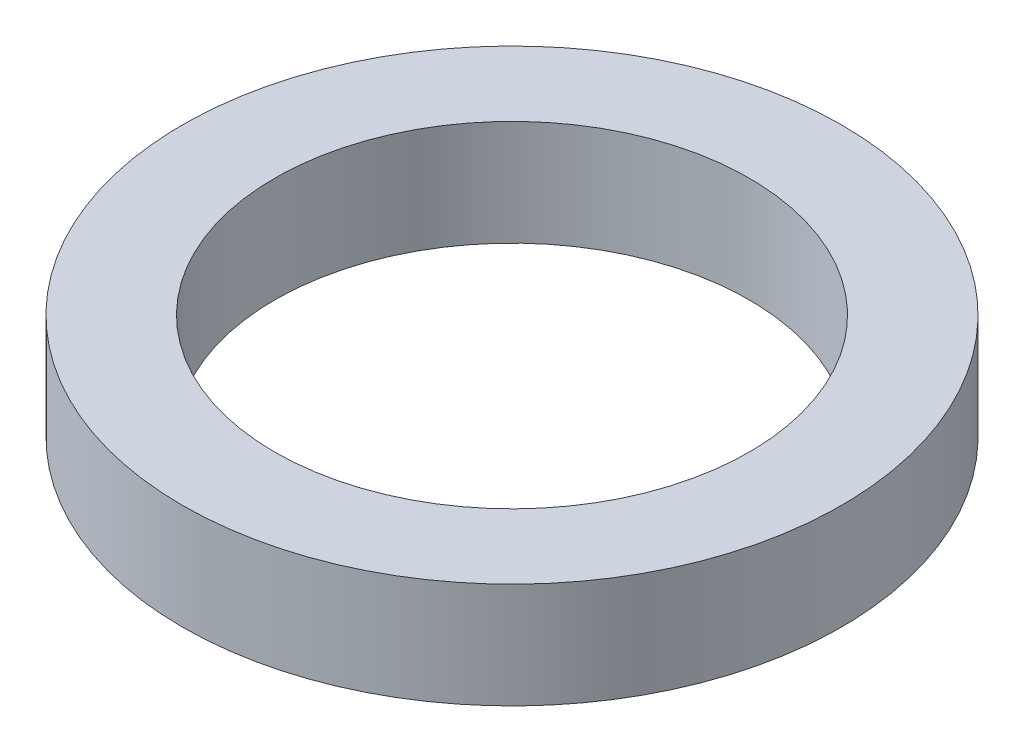
ISO-10303-21;
HEADER;
FILE_DESCRIPTION(('STEP AP214'),'2;1');
FILE_NAME('part.step','',(''),(''),'','','');
FILE_SCHEMA(('AUTOMOTIVE_DESIGN { 1 0 10303 214 1 1 1 1 }'));
ENDSEC;
DATA;
#1=APPLICATION_CONTEXT('core data for automotive mechanical design processes');
#2=APPLICATION_PROTOCOL_DEFINITION('international standard','automotive_design',2000,#1);
#3=PRODUCT_CONTEXT('',#1,'mechanical');
#4=PRODUCT('Part','Part','',(#3));
#5=PRODUCT_RELATED_PRODUCT_CATEGORY('part','',(#4));
#6=PRODUCT_DEFINITION_FORMATION('','',#4);
#7=PRODUCT_DEFINITION_CONTEXT('part definition',#1,'design');
#8=PRODUCT_DEFINITION('design','',#6,#7);
#9=PRODUCT_DEFINITION_SHAPE('','',#8);
#10=(LENGTH_UNIT() NAMED_UNIT(*) SI_UNIT(.MILLI.,.METRE.));
#11=(NAMED_UNIT(*) PLANE_ANGLE_UNIT() SI_UNIT($,.RADIAN.));
#12=(NAMED_UNIT(*) SI_UNIT($,.STERADIAN.) SOLID_ANGLE_UNIT());
#13=UNCERTAINTY_MEASURE_WITH_UNIT(LENGTH_MEASURE(1.E-05),#10,'distance_accuracy_value','');
#14=(GEOMETRIC_REPRESENTATION_CONTEXT(3) GLOBAL_UNCERTAINTY_ASSIGNED_CONTEXT((#13)) GLOBAL_UNIT_ASSIGNED_CONTEXT((#10,
#11,#12)) REPRESENTATION_CONTEXT('',''));
#15=CARTESIAN_POINT('',(0.,0.,0.));
#16=DIRECTION('',(0.,0.,1.));
#17=DIRECTION('',(1.,0.,0.));
#18=AXIS2_PLACEMENT_3D('',#15,#16,#17);
#19=CARTESIAN_POINT('',(0.,20.,0.));
#20=DIRECTION('',(0.,1.,0.));
#21=DIRECTION('',(0.,0.,1.));
#22=AXIS2_PLACEMENT_3D('',#19,#20,#21);
#23=PLANE('',#22);
#24=CARTESIAN_POINT('',(0.,20.,0.));
#25=DIRECTION('',(0.,1.,0.));
#26=DIRECTION('',(0.,0.,1.));
#27=AXIS2_PLACEMENT_3D('',#24,#25,#26);
#28=CIRCLE('',#27,62.5);
#29=CARTESIAN_POINT('',(0.,20.,62.5));
#30=VERTEX_POINT('',#29);
#31=EDGE_CURVE('E10',#30,#30,#28,.T.);
#32=ORIENTED_EDGE('',*,*,#31,.T.);
#33=EDGE_LOOP('',(#32));
#34=FACE_BOUND('',#33,.T.);
#35=CARTESIAN_POINT('',(0.,20.,0.));
#36=DIRECTION('',(0.,1.,0.));
#37=DIRECTION('',(0.,0.,1.));
#38=AXIS2_PLACEMENT_3D('',#35,#36,#37);
#39=CIRCLE('',#38,45.);
#40=CARTESIAN_POINT('',(0.,20.,45.));
#41=VERTEX_POINT('',#40);
#42=EDGE_CURVE('E44',#41,#41,#39,.T.);
#43=ORIENTED_EDGE('',*,*,#42,.F.);
#44=EDGE_LOOP('',(#43));
#45=FACE_BOUND('',#44,.T.);
#46=ADVANCED_FACE('F33',(#34,#45),#23,.T.);
#47=CARTESIAN_POINT('',(0.,0.,0.));
#48=DIRECTION('',(0.,1.,0.));
#49=DIRECTION('',(0.,0.,1.));
#50=AXIS2_PLACEMENT_3D('',#47,#48,#49);
#51=PLANE('',#50);
#52=CARTESIAN_POINT('',(0.,0.,0.));
#53=DIRECTION('',(0.,1.,0.));
#54=DIRECTION('',(0.,0.,1.));
#55=AXIS2_PLACEMENT_3D('',#52,#53,#54);
#56=CIRCLE('',#55,62.5);
#57=CARTESIAN_POINT('',(0.,0.,62.5));
#58=VERTEX_POINT('',#57);
#59=EDGE_CURVE('E37',#58,#58,#56,.T.);
#60=ORIENTED_EDGE('',*,*,#59,.F.);
#61=EDGE_LOOP('',(#60));
#62=FACE_BOUND('',#61,.T.);
#63=CARTESIAN_POINT('',(0.,0.,0.));
#64=DIRECTION('',(0.,1.,0.));
#65=DIRECTION('',(0.,0.,1.));
#66=AXIS2_PLACEMENT_3D('',#63,#64,#65);
#67=CIRCLE('',#66,45.);
#68=CARTESIAN_POINT('',(0.,0.,45.));
#69=VERTEX_POINT('',#68);
#70=EDGE_CURVE('E46',#69,#69,#67,.T.);
#71=ORIENTED_EDGE('',*,*,#70,.T.);
#72=EDGE_LOOP('',(#71));
#73=FACE_BOUND('',#72,.T.);
#74=ADVANCED_FACE('F56',(#62,#73),#51,.F.);
#75=CARTESIAN_POINT('',(0.,20.,0.));
#76=DIRECTION('',(0.,-1.,0.));
#77=DIRECTION('',(0.,0.,-1.));
#78=AXIS2_PLACEMENT_3D('',#75,#76,#77);
#79=CYLINDRICAL_SURFACE('',#78,62.5);
#80=ORIENTED_EDGE('',*,*,#31,.F.);
#81=EDGE_LOOP('',(#80));
#82=FACE_BOUND('',#81,.T.);
#83=ORIENTED_EDGE('',*,*,#59,.T.);
#84=EDGE_LOOP('',(#83));
#85=FACE_BOUND('',#84,.T.);
#86=ADVANCED_FACE('F35',(#82,#85),#79,.T.);
#87=CARTESIAN_POINT('',(0.,20.,0.));
#88=DIRECTION('',(0.,-1.,0.));
#89=DIRECTION('',(0.,0.,-1.));
#90=AXIS2_PLACEMENT_3D('',#87,#88,#89);
#91=CYLINDRICAL_SURFACE('',#90,45.);
#92=ORIENTED_EDGE('',*,*,#42,.T.);
#93=EDGE_LOOP('',(#92));
#94=FACE_BOUND('',#93,.T.);
#95=ORIENTED_EDGE('',*,*,#70,.F.);
#96=EDGE_LOOP('',(#95));
#97=FACE_BOUND('',#96,.T.);
#98=ADVANCED_FACE('F52',(#94,#97),#91,.F.);
#99=CLOSED_SHELL('',(#46,#74,#86,#98));
#100=MANIFOLD_SOLID_BREP('B2',#99);
#101=ADVANCED_BREP_SHAPE_REPRESENTATION('',(#18,#100),#14);
#102=SHAPE_DEFINITION_REPRESENTATION(#9,#101);
ENDSEC;
END-ISO-10303-21;
